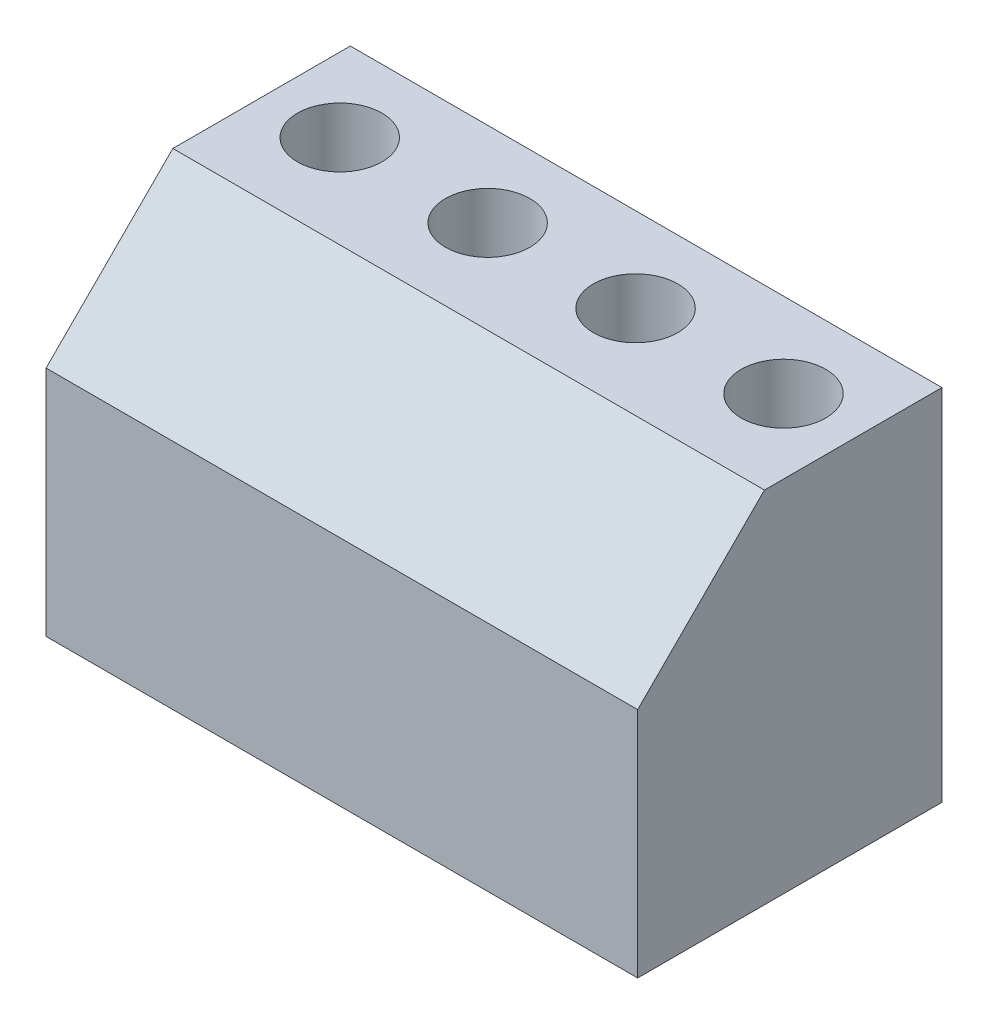
ISO-10303-21;
HEADER;
FILE_DESCRIPTION(('STEP AP214'),'2;1');
FILE_NAME('part.step','',(''),(''),'','','');
FILE_SCHEMA(('AUTOMOTIVE_DESIGN { 1 0 10303 214 1 1 1 1 }'));
ENDSEC;
DATA;
#1=APPLICATION_CONTEXT('core data for automotive mechanical design processes');
#2=APPLICATION_PROTOCOL_DEFINITION('international standard','automotive_design',2000,#1);
#3=PRODUCT_CONTEXT('',#1,'mechanical');
#4=PRODUCT('Part','Part','',(#3));
#5=PRODUCT_RELATED_PRODUCT_CATEGORY('part','',(#4));
#6=PRODUCT_DEFINITION_FORMATION('','',#4);
#7=PRODUCT_DEFINITION_CONTEXT('part definition',#1,'design');
#8=PRODUCT_DEFINITION('design','',#6,#7);
#9=PRODUCT_DEFINITION_SHAPE('','',#8);
#10=(LENGTH_UNIT() NAMED_UNIT(*) SI_UNIT(.MILLI.,.METRE.));
#11=(NAMED_UNIT(*) PLANE_ANGLE_UNIT() SI_UNIT($,.RADIAN.));
#12=(NAMED_UNIT(*) SI_UNIT($,.STERADIAN.) SOLID_ANGLE_UNIT());
#13=UNCERTAINTY_MEASURE_WITH_UNIT(LENGTH_MEASURE(1.E-05),#10,'distance_accuracy_value','');
#14=(GEOMETRIC_REPRESENTATION_CONTEXT(3) GLOBAL_UNCERTAINTY_ASSIGNED_CONTEXT((#13)) GLOBAL_UNIT_ASSIGNED_CONTEXT((#10,
#11,#12)) REPRESENTATION_CONTEXT('',''));
#15=CARTESIAN_POINT('',(0.,0.,0.));
#16=DIRECTION('',(0.,0.,1.));
#17=DIRECTION('',(1.,0.,0.));
#18=AXIS2_PLACEMENT_3D('',#15,#16,#17);
#19=CARTESIAN_POINT('',(0.,8.5,0.));
#20=DIRECTION('',(1.,0.,0.));
#21=DIRECTION('',(0.,0.,-1.));
#22=AXIS2_PLACEMENT_3D('',#19,#20,#21);
#23=PLANE('',#22);
#24=DIRECTION('',(0.,-1.,0.));
#25=VECTOR('',#24,1.);
#26=CARTESIAN_POINT('',(0.,8.5,0.));
#27=LINE('',#26,#25);
#28=CARTESIAN_POINT('',(0.,5.49999999999999,0.));
#29=VERTEX_POINT('',#28);
#30=CARTESIAN_POINT('',(0.,0.,0.));
#31=VERTEX_POINT('',#30);
#32=EDGE_CURVE('E116',#29,#31,#27,.T.);
#33=ORIENTED_EDGE('',*,*,#32,.F.);
#34=DIRECTION('',(0.,-0.707106781186549,0.707106781186546));
#35=VECTOR('',#34,1.);
#36=CARTESIAN_POINT('',(0.,8.5,-3.));
#37=LINE('',#36,#35);
#38=CARTESIAN_POINT('',(0.,8.5,-3.));
#39=VERTEX_POINT('',#38);
#40=EDGE_CURVE('E11',#29,#39,#37,.F.);
#41=ORIENTED_EDGE('',*,*,#40,.T.);
#42=DIRECTION('',(0.,0.,1.));
#43=VECTOR('',#42,1.);
#44=CARTESIAN_POINT('',(0.,8.5,0.));
#45=LINE('',#44,#43);
#46=CARTESIAN_POINT('',(0.,8.5,-7.2));
#47=VERTEX_POINT('',#46);
#48=EDGE_CURVE('E86',#47,#39,#45,.T.);
#49=ORIENTED_EDGE('',*,*,#48,.F.);
#50=DIRECTION('',(0.,-1.,0.));
#51=VECTOR('',#50,1.);
#52=CARTESIAN_POINT('',(0.,8.5,-7.2));
#53=LINE('',#52,#51);
#54=CARTESIAN_POINT('',(0.,0.,-7.2));
#55=VERTEX_POINT('',#54);
#56=EDGE_CURVE('E96',#47,#55,#53,.T.);
#57=ORIENTED_EDGE('',*,*,#56,.T.);
#58=DIRECTION('',(0.,0.,1.));
#59=VECTOR('',#58,1.);
#60=CARTESIAN_POINT('',(0.,0.,0.));
#61=LINE('',#60,#59);
#62=EDGE_CURVE('E105',#55,#31,#61,.T.);
#63=ORIENTED_EDGE('',*,*,#62,.T.);
#64=EDGE_LOOP('',(#33,#41,#49,#57,#63));
#65=FACE_BOUND('',#64,.T.);
#66=ADVANCED_FACE('F33',(#65),#23,.F.);
#67=CARTESIAN_POINT('',(0.,8.5,0.));
#68=DIRECTION('',(0.,0.,-1.));
#69=DIRECTION('',(-1.,0.,0.));
#70=AXIS2_PLACEMENT_3D('',#67,#68,#69);
#71=PLANE('',#70);
#72=DIRECTION('',(0.,-1.,0.));
#73=VECTOR('',#72,1.);
#74=CARTESIAN_POINT('',(14.,8.5,0.));
#75=LINE('',#74,#73);
#76=CARTESIAN_POINT('',(14.,5.49999999999999,0.));
#77=VERTEX_POINT('',#76);
#78=CARTESIAN_POINT('',(14.,0.,0.));
#79=VERTEX_POINT('',#78);
#80=EDGE_CURVE('E95',#77,#79,#75,.T.);
#81=ORIENTED_EDGE('',*,*,#80,.F.);
#82=DIRECTION('',(-1.,0.,0.));
#83=VECTOR('',#82,1.);
#84=CARTESIAN_POINT('',(0.,5.49999999999999,0.));
#85=LINE('',#84,#83);
#86=EDGE_CURVE('E41',#77,#29,#85,.T.);
#87=ORIENTED_EDGE('',*,*,#86,.T.);
#88=ORIENTED_EDGE('',*,*,#32,.T.);
#89=DIRECTION('',(1.,0.,0.));
#90=VECTOR('',#89,1.);
#91=CARTESIAN_POINT('',(0.,0.,0.));
#92=LINE('',#91,#90);
#93=EDGE_CURVE('E108',#31,#79,#92,.T.);
#94=ORIENTED_EDGE('',*,*,#93,.T.);
#95=EDGE_LOOP('',(#81,#87,#88,#94));
#96=FACE_BOUND('',#95,.T.);
#97=ADVANCED_FACE('F120',(#96),#71,.F.);
#98=CARTESIAN_POINT('',(14.,8.5,0.));
#99=DIRECTION('',(-1.,0.,0.));
#100=DIRECTION('',(0.,0.,1.));
#101=AXIS2_PLACEMENT_3D('',#98,#99,#100);
#102=PLANE('',#101);
#103=DIRECTION('',(0.,0.,-1.));
#104=VECTOR('',#103,1.);
#105=CARTESIAN_POINT('',(14.,8.5,0.));
#106=LINE('',#105,#104);
#107=CARTESIAN_POINT('',(14.,8.5,-3.));
#108=VERTEX_POINT('',#107);
#109=CARTESIAN_POINT('',(14.,8.5,-7.2));
#110=VERTEX_POINT('',#109);
#111=EDGE_CURVE('E77',#108,#110,#106,.T.);
#112=ORIENTED_EDGE('',*,*,#111,.F.);
#113=DIRECTION('',(0.,0.707106781186549,-0.707106781186546));
#114=VECTOR('',#113,1.);
#115=CARTESIAN_POINT('',(14.,8.5,-3.));
#116=LINE('',#115,#114);
#117=EDGE_CURVE('E55',#108,#77,#116,.F.);
#118=ORIENTED_EDGE('',*,*,#117,.T.);
#119=ORIENTED_EDGE('',*,*,#80,.T.);
#120=DIRECTION('',(0.,0.,-1.));
#121=VECTOR('',#120,1.);
#122=CARTESIAN_POINT('',(14.,0.,0.));
#123=LINE('',#122,#121);
#124=CARTESIAN_POINT('',(14.,0.,-7.2));
#125=VERTEX_POINT('',#124);
#126=EDGE_CURVE('E92',#79,#125,#123,.T.);
#127=ORIENTED_EDGE('',*,*,#126,.T.);
#128=DIRECTION('',(0.,-1.,0.));
#129=VECTOR('',#128,1.);
#130=CARTESIAN_POINT('',(14.,8.5,-7.2));
#131=LINE('',#130,#129);
#132=EDGE_CURVE('E89',#110,#125,#131,.T.);
#133=ORIENTED_EDGE('',*,*,#132,.F.);
#134=EDGE_LOOP('',(#112,#118,#119,#127,#133));
#135=FACE_BOUND('',#134,.T.);
#136=ADVANCED_FACE('F90',(#135),#102,.F.);
#137=CARTESIAN_POINT('',(0.,8.5,-7.2));
#138=DIRECTION('',(0.,0.,1.));
#139=DIRECTION('',(1.,0.,0.));
#140=AXIS2_PLACEMENT_3D('',#137,#138,#139);
#141=PLANE('',#140);
#142=DIRECTION('',(-1.,0.,0.));
#143=VECTOR('',#142,1.);
#144=CARTESIAN_POINT('',(0.,0.,-7.2));
#145=LINE('',#144,#143);
#146=EDGE_CURVE('E113',#125,#55,#145,.T.);
#147=ORIENTED_EDGE('',*,*,#146,.T.);
#148=ORIENTED_EDGE('',*,*,#56,.F.);
#149=DIRECTION('',(-1.,0.,0.));
#150=VECTOR('',#149,1.);
#151=CARTESIAN_POINT('',(0.,8.5,-7.2));
#152=LINE('',#151,#150);
#153=EDGE_CURVE('E82',#110,#47,#152,.T.);
#154=ORIENTED_EDGE('',*,*,#153,.F.);
#155=ORIENTED_EDGE('',*,*,#132,.T.);
#156=EDGE_LOOP('',(#147,#148,#154,#155));
#157=FACE_BOUND('',#156,.T.);
#158=ADVANCED_FACE('F98',(#157),#141,.F.);
#159=CARTESIAN_POINT('',(0.,8.5,0.));
#160=DIRECTION('',(0.,-1.,0.));
#161=DIRECTION('',(0.,0.,-1.));
#162=AXIS2_PLACEMENT_3D('',#159,#160,#161);
#163=PLANE('',#162);
#164=CARTESIAN_POINT('',(12.25,8.5,-5.2));
#165=DIRECTION('',(0.,1.,0.));
#166=DIRECTION('',(0.,0.,1.));
#167=AXIS2_PLACEMENT_3D('',#164,#165,#166);
#168=CIRCLE('',#167,1.);
#169=CARTESIAN_POINT('',(12.25,8.5,-4.2));
#170=VERTEX_POINT('',#169);
#171=EDGE_CURVE('E145',#170,#170,#168,.T.);
#172=ORIENTED_EDGE('',*,*,#171,.F.);
#173=EDGE_LOOP('',(#172));
#174=FACE_BOUND('',#173,.T.);
#175=CARTESIAN_POINT('',(8.75,8.5,-5.2));
#176=DIRECTION('',(0.,1.,0.));
#177=DIRECTION('',(0.,0.,1.));
#178=AXIS2_PLACEMENT_3D('',#175,#176,#177);
#179=CIRCLE('',#178,1.);
#180=CARTESIAN_POINT('',(8.75,8.5,-4.2));
#181=VERTEX_POINT('',#180);
#182=EDGE_CURVE('E139',#181,#181,#179,.T.);
#183=ORIENTED_EDGE('',*,*,#182,.F.);
#184=EDGE_LOOP('',(#183));
#185=FACE_BOUND('',#184,.T.);
#186=CARTESIAN_POINT('',(5.25,8.5,-5.2));
#187=DIRECTION('',(0.,1.,0.));
#188=DIRECTION('',(0.,0.,1.));
#189=AXIS2_PLACEMENT_3D('',#186,#187,#188);
#190=CIRCLE('',#189,1.);
#191=CARTESIAN_POINT('',(5.25,8.5,-4.2));
#192=VERTEX_POINT('',#191);
#193=EDGE_CURVE('E133',#192,#192,#190,.T.);
#194=ORIENTED_EDGE('',*,*,#193,.F.);
#195=EDGE_LOOP('',(#194));
#196=FACE_BOUND('',#195,.T.);
#197=CARTESIAN_POINT('',(1.75,8.5,-5.2));
#198=DIRECTION('',(0.,1.,0.));
#199=DIRECTION('',(0.,0.,1.));
#200=AXIS2_PLACEMENT_3D('',#197,#198,#199);
#201=CIRCLE('',#200,1.);
#202=CARTESIAN_POINT('',(1.75,8.5,-4.2));
#203=VERTEX_POINT('',#202);
#204=EDGE_CURVE('E127',#203,#203,#201,.T.);
#205=ORIENTED_EDGE('',*,*,#204,.F.);
#206=EDGE_LOOP('',(#205));
#207=FACE_BOUND('',#206,.T.);
#208=ORIENTED_EDGE('',*,*,#48,.T.);
#209=DIRECTION('',(1.,0.,0.));
#210=VECTOR('',#209,1.);
#211=CARTESIAN_POINT('',(0.,8.5,-3.));
#212=LINE('',#211,#210);
#213=EDGE_CURVE('E85',#39,#108,#212,.T.);
#214=ORIENTED_EDGE('',*,*,#213,.T.);
#215=ORIENTED_EDGE('',*,*,#111,.T.);
#216=ORIENTED_EDGE('',*,*,#153,.T.);
#217=EDGE_LOOP('',(#208,#214,#215,#216));
#218=FACE_BOUND('',#217,.T.);
#219=ADVANCED_FACE('F80',(#174,#185,#196,#207,#218),#163,.F.);
#220=CARTESIAN_POINT('',(0.,0.,0.));
#221=DIRECTION('',(0.,-1.,0.));
#222=DIRECTION('',(0.,0.,-1.));
#223=AXIS2_PLACEMENT_3D('',#220,#221,#222);
#224=PLANE('',#223);
#225=ORIENTED_EDGE('',*,*,#62,.F.);
#226=ORIENTED_EDGE('',*,*,#146,.F.);
#227=ORIENTED_EDGE('',*,*,#126,.F.);
#228=ORIENTED_EDGE('',*,*,#93,.F.);
#229=EDGE_LOOP('',(#225,#226,#227,#228));
#230=FACE_BOUND('',#229,.T.);
#231=ADVANCED_FACE('F125',(#230),#224,.T.);
#232=CARTESIAN_POINT('',(0.,8.5,-3.));
#233=DIRECTION('',(0.,-0.707106781186546,-0.707106781186549));
#234=DIRECTION('',(1.,0.,0.));
#235=AXIS2_PLACEMENT_3D('',#232,#233,#234);
#236=PLANE('',#235);
#237=ORIENTED_EDGE('',*,*,#40,.F.);
#238=ORIENTED_EDGE('',*,*,#86,.F.);
#239=ORIENTED_EDGE('',*,*,#117,.F.);
#240=ORIENTED_EDGE('',*,*,#213,.F.);
#241=EDGE_LOOP('',(#237,#238,#239,#240));
#242=FACE_BOUND('',#241,.T.);
#243=ADVANCED_FACE('F35',(#242),#236,.F.);
#244=CARTESIAN_POINT('',(1.75,4.5,-5.2));
#245=DIRECTION('',(0.,1.,0.));
#246=DIRECTION('',(0.,0.,1.));
#247=AXIS2_PLACEMENT_3D('',#244,#245,#246);
#248=CYLINDRICAL_SURFACE('',#247,1.);
#249=CARTESIAN_POINT('',(1.75,4.5,-5.2));
#250=DIRECTION('',(0.,1.,0.));
#251=DIRECTION('',(0.,0.,1.));
#252=AXIS2_PLACEMENT_3D('',#249,#250,#251);
#253=CIRCLE('',#252,1.);
#254=CARTESIAN_POINT('',(1.75,4.5,-4.2));
#255=VERTEX_POINT('',#254);
#256=EDGE_CURVE('E109',#255,#255,#253,.T.);
#257=ORIENTED_EDGE('',*,*,#256,.F.);
#258=EDGE_LOOP('',(#257));
#259=FACE_BOUND('',#258,.T.);
#260=ORIENTED_EDGE('',*,*,#204,.T.);
#261=EDGE_LOOP('',(#260));
#262=FACE_BOUND('',#261,.T.);
#263=ADVANCED_FACE('F169',(#259,#262),#248,.F.);
#264=CARTESIAN_POINT('',(1.75,4.5,-5.2));
#265=DIRECTION('',(0.,1.,0.));
#266=DIRECTION('',(0.,0.,1.));
#267=AXIS2_PLACEMENT_3D('',#264,#265,#266);
#268=PLANE('',#267);
#269=ORIENTED_EDGE('',*,*,#256,.T.);
#270=EDGE_LOOP('',(#269));
#271=FACE_BOUND('',#270,.T.);
#272=ADVANCED_FACE('F171',(#271),#268,.T.);
#273=CARTESIAN_POINT('',(5.25,4.5,-5.2));
#274=DIRECTION('',(0.,1.,0.));
#275=DIRECTION('',(0.,0.,1.));
#276=AXIS2_PLACEMENT_3D('',#273,#274,#275);
#277=CYLINDRICAL_SURFACE('',#276,1.);
#278=CARTESIAN_POINT('',(5.25,4.5,-5.2));
#279=DIRECTION('',(0.,1.,0.));
#280=DIRECTION('',(0.,0.,1.));
#281=AXIS2_PLACEMENT_3D('',#278,#279,#280);
#282=CIRCLE('',#281,1.);
#283=CARTESIAN_POINT('',(5.25,4.5,-4.2));
#284=VERTEX_POINT('',#283);
#285=EDGE_CURVE('E130',#284,#284,#282,.T.);
#286=ORIENTED_EDGE('',*,*,#285,.F.);
#287=EDGE_LOOP('',(#286));
#288=FACE_BOUND('',#287,.T.);
#289=ORIENTED_EDGE('',*,*,#193,.T.);
#290=EDGE_LOOP('',(#289));
#291=FACE_BOUND('',#290,.T.);
#292=ADVANCED_FACE('F178',(#288,#291),#277,.F.);
#293=CARTESIAN_POINT('',(5.25,4.5,-5.2));
#294=DIRECTION('',(0.,1.,0.));
#295=DIRECTION('',(0.,0.,1.));
#296=AXIS2_PLACEMENT_3D('',#293,#294,#295);
#297=PLANE('',#296);
#298=ORIENTED_EDGE('',*,*,#285,.T.);
#299=EDGE_LOOP('',(#298));
#300=FACE_BOUND('',#299,.T.);
#301=ADVANCED_FACE('F231',(#300),#297,.T.);
#302=CARTESIAN_POINT('',(8.75,4.5,-5.2));
#303=DIRECTION('',(0.,1.,0.));
#304=DIRECTION('',(0.,0.,1.));
#305=AXIS2_PLACEMENT_3D('',#302,#303,#304);
#306=CYLINDRICAL_SURFACE('',#305,1.);
#307=CARTESIAN_POINT('',(8.75,4.5,-5.2));
#308=DIRECTION('',(0.,1.,0.));
#309=DIRECTION('',(0.,0.,1.));
#310=AXIS2_PLACEMENT_3D('',#307,#308,#309);
#311=CIRCLE('',#310,1.);
#312=CARTESIAN_POINT('',(8.75,4.5,-4.2));
#313=VERTEX_POINT('',#312);
#314=EDGE_CURVE('E136',#313,#313,#311,.T.);
#315=ORIENTED_EDGE('',*,*,#314,.F.);
#316=EDGE_LOOP('',(#315));
#317=FACE_BOUND('',#316,.T.);
#318=ORIENTED_EDGE('',*,*,#182,.T.);
#319=EDGE_LOOP('',(#318));
#320=FACE_BOUND('',#319,.T.);
#321=ADVANCED_FACE('F241',(#317,#320),#306,.F.);
#322=CARTESIAN_POINT('',(8.75,4.5,-5.2));
#323=DIRECTION('',(0.,1.,0.));
#324=DIRECTION('',(0.,0.,1.));
#325=AXIS2_PLACEMENT_3D('',#322,#323,#324);
#326=PLANE('',#325);
#327=ORIENTED_EDGE('',*,*,#314,.T.);
#328=EDGE_LOOP('',(#327));
#329=FACE_BOUND('',#328,.T.);
#330=ADVANCED_FACE('F156',(#329),#326,.T.);
#331=CARTESIAN_POINT('',(12.25,4.5,-5.2));
#332=DIRECTION('',(0.,1.,0.));
#333=DIRECTION('',(0.,0.,1.));
#334=AXIS2_PLACEMENT_3D('',#331,#332,#333);
#335=CYLINDRICAL_SURFACE('',#334,1.);
#336=CARTESIAN_POINT('',(12.25,4.5,-5.2));
#337=DIRECTION('',(0.,1.,0.));
#338=DIRECTION('',(0.,0.,1.));
#339=AXIS2_PLACEMENT_3D('',#336,#337,#338);
#340=CIRCLE('',#339,1.);
#341=CARTESIAN_POINT('',(12.25,4.5,-4.2));
#342=VERTEX_POINT('',#341);
#343=EDGE_CURVE('E142',#342,#342,#340,.T.);
#344=ORIENTED_EDGE('',*,*,#343,.F.);
#345=EDGE_LOOP('',(#344));
#346=FACE_BOUND('',#345,.T.);
#347=ORIENTED_EDGE('',*,*,#171,.T.);
#348=EDGE_LOOP('',(#347));
#349=FACE_BOUND('',#348,.T.);
#350=ADVANCED_FACE('F153',(#346,#349),#335,.F.);
#351=CARTESIAN_POINT('',(12.25,4.5,-5.2));
#352=DIRECTION('',(0.,1.,0.));
#353=DIRECTION('',(0.,0.,1.));
#354=AXIS2_PLACEMENT_3D('',#351,#352,#353);
#355=PLANE('',#354);
#356=ORIENTED_EDGE('',*,*,#343,.T.);
#357=EDGE_LOOP('',(#356));
#358=FACE_BOUND('',#357,.T.);
#359=ADVANCED_FACE('F151',(#358),#355,.T.);
#360=CLOSED_SHELL('',(#66,#97,#136,#158,#219,#231,#243,#263,#272,#292,#301,#321,#330,#350,#359));
#361=MANIFOLD_SOLID_BREP('B2',#360);
#362=ADVANCED_BREP_SHAPE_REPRESENTATION('',(#18,#361),#14);
#363=SHAPE_DEFINITION_REPRESENTATION(#9,#362);
ENDSEC;
END-ISO-10303-21;
